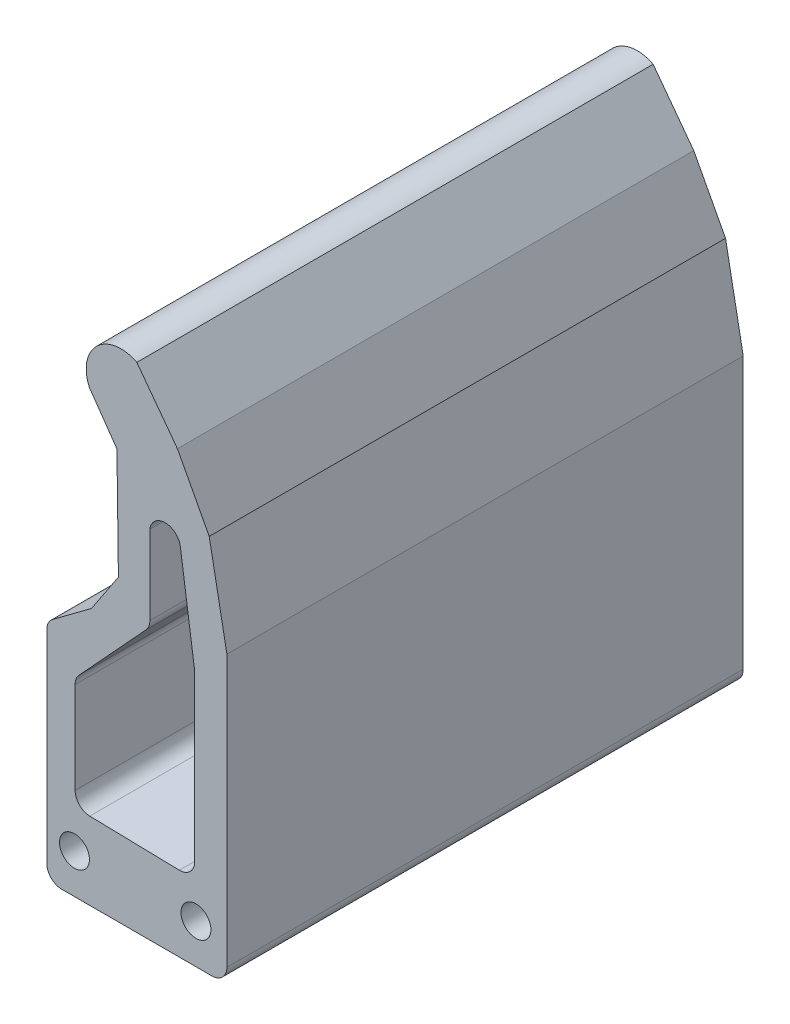
ISO-10303-21;
HEADER;
FILE_DESCRIPTION(('STEP AP214'),'2;1');
FILE_NAME('part.step','',(''),(''),'','','');
FILE_SCHEMA(('AUTOMOTIVE_DESIGN { 1 0 10303 214 1 1 1 1 }'));
ENDSEC;
DATA;
#1=APPLICATION_CONTEXT('core data for automotive mechanical design processes');
#2=APPLICATION_PROTOCOL_DEFINITION('international standard','automotive_design',2000,#1);
#3=PRODUCT_CONTEXT('',#1,'mechanical');
#4=PRODUCT('Part','Part','',(#3));
#5=PRODUCT_RELATED_PRODUCT_CATEGORY('part','',(#4));
#6=PRODUCT_DEFINITION_FORMATION('','',#4);
#7=PRODUCT_DEFINITION_CONTEXT('part definition',#1,'design');
#8=PRODUCT_DEFINITION('design','',#6,#7);
#9=PRODUCT_DEFINITION_SHAPE('','',#8);
#10=(LENGTH_UNIT() NAMED_UNIT(*) SI_UNIT(.MILLI.,.METRE.));
#11=(NAMED_UNIT(*) PLANE_ANGLE_UNIT() SI_UNIT($,.RADIAN.));
#12=(NAMED_UNIT(*) SI_UNIT($,.STERADIAN.) SOLID_ANGLE_UNIT());
#13=UNCERTAINTY_MEASURE_WITH_UNIT(LENGTH_MEASURE(1.E-05),#10,'distance_accuracy_value','');
#14=(GEOMETRIC_REPRESENTATION_CONTEXT(3) GLOBAL_UNCERTAINTY_ASSIGNED_CONTEXT((#13)) GLOBAL_UNIT_ASSIGNED_CONTEXT((#10,
#11,#12)) REPRESENTATION_CONTEXT('',''));
#15=CARTESIAN_POINT('',(0.,0.,0.));
#16=DIRECTION('',(0.,0.,1.));
#17=DIRECTION('',(1.,0.,0.));
#18=AXIS2_PLACEMENT_3D('',#15,#16,#17);
#19=CARTESIAN_POINT('',(-309.924389929028,378.849501293892,74.5));
#20=DIRECTION('',(0.,0.,-1.));
#21=DIRECTION('',(-1.,0.,0.));
#22=AXIS2_PLACEMENT_3D('',#19,#20,#21);
#23=PLANE('',#22);
#24=CARTESIAN_POINT('',(-313.031111026464,350.560286037333,74.5));
#25=DIRECTION('',(0.,0.,1.));
#26=DIRECTION('',(1.,0.,0.));
#27=AXIS2_PLACEMENT_3D('',#24,#25,#26);
#28=CIRCLE('',#27,0.999999999999998);
#29=CARTESIAN_POINT('',(-312.031111026464,350.560286037333,74.5));
#30=VERTEX_POINT('',#29);
#31=EDGE_CURVE('E696',#30,#30,#28,.T.);
#32=ORIENTED_EDGE('',*,*,#31,.F.);
#33=EDGE_LOOP('',(#32));
#34=FACE_BOUND('',#33,.T.);
#35=CARTESIAN_POINT('',(-304.914519909812,350.560286037333,74.5));
#36=DIRECTION('',(0.,0.,1.));
#37=DIRECTION('',(1.,0.,0.));
#38=AXIS2_PLACEMENT_3D('',#35,#36,#37);
#39=CIRCLE('',#38,0.999999999999998);
#40=CARTESIAN_POINT('',(-303.914519909812,350.560286037333,74.5));
#41=VERTEX_POINT('',#40);
#42=EDGE_CURVE('E406',#41,#41,#39,.T.);
#43=ORIENTED_EDGE('',*,*,#42,.F.);
#44=EDGE_LOOP('',(#43));
#45=FACE_BOUND('',#44,.T.);
#46=DIRECTION('',(0.,-1.,0.));
#47=VECTOR('',#46,1.);
#48=CARTESIAN_POINT('',(-314.881683349609,362.936676025391,74.5));
#49=LINE('',#48,#47);
#50=CARTESIAN_POINT('',(-314.881683349609,362.434701670394,74.5));
#51=VERTEX_POINT('',#50);
#52=CARTESIAN_POINT('',(-314.881683349609,348.91843813295,74.5));
#53=VERTEX_POINT('',#52);
#54=EDGE_CURVE('E271',#51,#53,#49,.T.);
#55=ORIENTED_EDGE('',*,*,#54,.T.);
#56=CARTESIAN_POINT('',(-313.881683349609,348.91843813295,74.5));
#57=DIRECTION('',(0.,0.,-1.));
#58=DIRECTION('',(-1.,0.,0.));
#59=AXIS2_PLACEMENT_3D('',#56,#57,#58);
#60=CIRCLE('',#59,1.);
#61=CARTESIAN_POINT('',(-313.881683349609,347.91843813295,74.5));
#62=VERTEX_POINT('',#61);
#63=EDGE_CURVE('E357',#53,#62,#60,.F.);
#64=ORIENTED_EDGE('',*,*,#63,.T.);
#65=DIRECTION('',(1.,0.,0.));
#66=VECTOR('',#65,1.);
#67=CARTESIAN_POINT('',(-314.881683349609,347.91843813295,74.5));
#68=LINE('',#67,#66);
#69=CARTESIAN_POINT('',(-303.847373472753,347.91843813295,74.5));
#70=VERTEX_POINT('',#69);
#71=EDGE_CURVE('E274',#62,#70,#68,.T.);
#72=ORIENTED_EDGE('',*,*,#71,.T.);
#73=CARTESIAN_POINT('',(-303.847373472753,348.91843813295,74.5));
#74=DIRECTION('',(0.,0.,-1.));
#75=DIRECTION('',(-1.,0.,0.));
#76=AXIS2_PLACEMENT_3D('',#73,#74,#75);
#77=CIRCLE('',#76,1.);
#78=CARTESIAN_POINT('',(-302.847373472753,348.918438132951,74.5));
#79=VERTEX_POINT('',#78);
#80=EDGE_CURVE('E355',#70,#79,#77,.F.);
#81=ORIENTED_EDGE('',*,*,#80,.T.);
#82=DIRECTION('',(0.,1.,0.));
#83=VECTOR('',#82,1.);
#84=CARTESIAN_POINT('',(-302.847373472753,347.91843813295,74.5));
#85=LINE('',#84,#83);
#86=CARTESIAN_POINT('',(-302.847373472753,367.045563249939,74.5));
#87=VERTEX_POINT('',#86);
#88=EDGE_CURVE('E277',#79,#87,#85,.T.);
#89=ORIENTED_EDGE('',*,*,#88,.T.);
#90=DIRECTION('',(-0.186540617008645,0.982447249579352,0.));
#91=VECTOR('',#90,1.);
#92=CARTESIAN_POINT('',(-302.847373472753,367.045563249939,74.5));
#93=LINE('',#92,#91);
#94=CARTESIAN_POINT('',(-304.02806020837,373.263846724187,74.5));
#95=VERTEX_POINT('',#94);
#96=EDGE_CURVE('E279',#87,#95,#93,.T.);
#97=ORIENTED_EDGE('',*,*,#96,.T.);
#98=DIRECTION('',(-0.467887720418968,0.883787916347096,0.));
#99=VECTOR('',#98,1.);
#100=CARTESIAN_POINT('',(-304.02806020837,373.263846724187,74.5));
#101=LINE('',#100,#99);
#102=CARTESIAN_POINT('',(-306.153296332479,377.278181625284,74.5));
#103=VERTEX_POINT('',#102);
#104=EDGE_CURVE('E281',#95,#103,#101,.T.);
#105=ORIENTED_EDGE('',*,*,#104,.T.);
#106=DIRECTION('',(-0.597471837141253,0.801889895074789,0.));
#107=VECTOR('',#106,1.);
#108=CARTESIAN_POINT('',(-306.153296332479,377.278181625284,74.5));
#109=LINE('',#108,#107);
#110=CARTESIAN_POINT('',(-308.864528411181,380.917030307284,74.5));
#111=VERTEX_POINT('',#110);
#112=EDGE_CURVE('E283',#103,#111,#109,.T.);
#113=ORIENTED_EDGE('',*,*,#112,.T.);
#114=CARTESIAN_POINT('',(-309.924389929028,378.849501293892,74.5));
#115=DIRECTION('',(0.,0.,1.));
#116=DIRECTION('',(-1.,0.,0.));
#117=AXIS2_PLACEMENT_3D('',#114,#115,#116);
#118=CIRCLE('',#117,2.32335590433929);
#119=CARTESIAN_POINT('',(-312.030492527549,377.868524993092,74.5));
#120=VERTEX_POINT('',#119);
#121=EDGE_CURVE('E258',#111,#120,#118,.T.);
#122=ORIENTED_EDGE('',*,*,#121,.T.);
#123=DIRECTION('',(0.57346234436332,-0.819231920519046,0.));
#124=VECTOR('',#123,1.);
#125=CARTESIAN_POINT('',(-312.030492527549,377.868524993092,74.5));
#126=LINE('',#125,#124);
#127=CARTESIAN_POINT('',(-310.193868716589,375.244776691722,74.5));
#128=VERTEX_POINT('',#127);
#129=EDGE_CURVE('E261',#120,#128,#126,.T.);
#130=ORIENTED_EDGE('',*,*,#129,.T.);
#131=DIRECTION('',(0.0132778277471396,-0.999911845759574,0.));
#132=VECTOR('',#131,1.);
#133=CARTESIAN_POINT('',(-310.193868716589,375.244776691722,74.5));
#134=LINE('',#133,#132);
#135=CARTESIAN_POINT('',(-310.096008300781,367.875213623047,74.5));
#136=VERTEX_POINT('',#135);
#137=EDGE_CURVE('E264',#128,#136,#134,.T.);
#138=ORIENTED_EDGE('',*,*,#137,.T.);
#139=DIRECTION('',(-0.551967778134634,-0.833865439924881,0.));
#140=VECTOR('',#139,1.);
#141=CARTESIAN_POINT('',(-310.096008300781,367.875213623047,74.5));
#142=LINE('',#141,#140);
#143=CARTESIAN_POINT('',(-311.889068603516,365.166412353516,74.5));
#144=VERTEX_POINT('',#143);
#145=EDGE_CURVE('E266',#136,#144,#142,.T.);
#146=ORIENTED_EDGE('',*,*,#145,.T.);
#147=DIRECTION('',(-0.801889895074793,-0.597471837141247,0.));
#148=VECTOR('',#147,1.);
#149=CARTESIAN_POINT('',(-311.889068603516,365.166412353516,74.5));
#150=LINE('',#149,#148);
#151=CARTESIAN_POINT('',(-314.479155186751,363.236591565468,74.5));
#152=VERTEX_POINT('',#151);
#153=EDGE_CURVE('E268',#144,#152,#150,.T.);
#154=ORIENTED_EDGE('',*,*,#153,.T.);
#155=CARTESIAN_POINT('',(-313.881683349609,362.434701670394,74.5));
#156=DIRECTION('',(0.,0.,-1.));
#157=DIRECTION('',(-1.,0.,0.));
#158=AXIS2_PLACEMENT_3D('',#155,#156,#157);
#159=CIRCLE('',#158,1.);
#160=EDGE_CURVE('E353',#152,#51,#159,.F.);
#161=ORIENTED_EDGE('',*,*,#160,.T.);
#162=EDGE_LOOP('',(#55,#64,#72,#81,#89,#97,#105,#113,#122,#130,#138,#146,#154,#161));
#163=FACE_BOUND('',#162,.T.);
#164=DIRECTION('',(-0.677265288833009,-0.735738899706914,0.));
#165=VECTOR('',#164,1.);
#166=CARTESIAN_POINT('',(-312.988408733801,360.598376943002,74.5));
#167=LINE('',#166,#165);
#168=CARTESIAN_POINT('',(-308.25886216006,365.736262273391,74.5));
#169=VERTEX_POINT('',#168);
#170=CARTESIAN_POINT('',(-312.724147633508,360.885453771492,74.5));
#171=VERTEX_POINT('',#170);
#172=EDGE_CURVE('E255',#169,#171,#167,.T.);
#173=ORIENTED_EDGE('',*,*,#172,.F.);
#174=CARTESIAN_POINT('',(-308.994601059767,366.413527562224,74.5));
#175=DIRECTION('',(0.,0.,-1.));
#176=DIRECTION('',(-1.,0.,0.));
#177=AXIS2_PLACEMENT_3D('',#174,#175,#176);
#178=CIRCLE('',#177,1.);
#179=CARTESIAN_POINT('',(-307.994601059767,366.413527562224,74.5));
#180=VERTEX_POINT('',#179);
#181=EDGE_CURVE('E351',#169,#180,#178,.F.);
#182=ORIENTED_EDGE('',*,*,#181,.T.);
#183=DIRECTION('',(0.,-1.,0.));
#184=VECTOR('',#183,1.);
#185=CARTESIAN_POINT('',(-307.994601059767,366.023339101882,74.5));
#186=LINE('',#185,#184);
#187=CARTESIAN_POINT('',(-307.994601059767,371.702683918454,74.5));
#188=VERTEX_POINT('',#187);
#189=EDGE_CURVE('E229',#188,#180,#186,.T.);
#190=ORIENTED_EDGE('',*,*,#189,.F.);
#191=CARTESIAN_POINT('',(-306.975817077351,371.555647556688,74.5));
#192=DIRECTION('',(0.,0.,1.));
#193=DIRECTION('',(-1.,0.,0.));
#194=AXIS2_PLACEMENT_3D('',#191,#192,#193);
#195=CIRCLE('',#194,1.02933983431598);
#196=CARTESIAN_POINT('',(-305.952850341797,371.670013427734,74.5));
#197=VERTEX_POINT('',#196);
#198=EDGE_CURVE('E227',#197,#188,#195,.T.);
#199=ORIENTED_EDGE('',*,*,#198,.F.);
#200=DIRECTION('',(-0.141420088017463,0.989949674834601,0.));
#201=VECTOR('',#200,1.);
#202=CARTESIAN_POINT('',(-305.,365.,74.5));
#203=LINE('',#202,#201);
#204=CARTESIAN_POINT('',(-305.,365.,74.5));
#205=VERTEX_POINT('',#204);
#206=EDGE_CURVE('E212',#205,#197,#203,.T.);
#207=ORIENTED_EDGE('',*,*,#206,.F.);
#208=DIRECTION('',(0.,1.,0.));
#209=VECTOR('',#208,1.);
#210=CARTESIAN_POINT('',(-305.,352.927314192685,74.5));
#211=LINE('',#210,#209);
#212=CARTESIAN_POINT('',(-305.,353.950441861552,74.5));
#213=VERTEX_POINT('',#212);
#214=EDGE_CURVE('E202',#213,#205,#211,.T.);
#215=ORIENTED_EDGE('',*,*,#214,.F.);
#216=CARTESIAN_POINT('',(-306.,353.950441861552,74.5));
#217=DIRECTION('',(0.,0.,-1.));
#218=DIRECTION('',(-1.,0.,0.));
#219=AXIS2_PLACEMENT_3D('',#216,#217,#218);
#220=CIRCLE('',#219,1.);
#221=CARTESIAN_POINT('',(-306.022860294224,352.950703192225,74.5));
#222=VERTEX_POINT('',#221);
#223=EDGE_CURVE('E384',#213,#222,#220,.T.);
#224=ORIENTED_EDGE('',*,*,#223,.T.);
#225=DIRECTION('',(0.999738669327124,-0.0228602942245161,0.));
#226=VECTOR('',#225,1.);
#227=CARTESIAN_POINT('',(-312.988408733801,353.109979302722,74.5));
#228=LINE('',#227,#226);
#229=CARTESIAN_POINT('',(-312.011269028026,353.087635762497,74.5));
#230=VERTEX_POINT('',#229);
#231=EDGE_CURVE('E213',#230,#222,#228,.T.);
#232=ORIENTED_EDGE('',*,*,#231,.F.);
#233=CARTESIAN_POINT('',(-311.988408733801,354.087374431824,74.5));
#234=DIRECTION('',(0.,0.,-1.));
#235=DIRECTION('',(-1.,0.,0.));
#236=AXIS2_PLACEMENT_3D('',#233,#234,#235);
#237=CIRCLE('',#236,1.);
#238=CARTESIAN_POINT('',(-312.988408733801,354.087374431824,74.5));
#239=VERTEX_POINT('',#238);
#240=EDGE_CURVE('E49',#230,#239,#237,.T.);
#241=ORIENTED_EDGE('',*,*,#240,.T.);
#242=DIRECTION('',(0.,-1.,0.));
#243=VECTOR('',#242,1.);
#244=CARTESIAN_POINT('',(-312.988408733801,360.598376943002,74.5));
#245=LINE('',#244,#243);
#246=CARTESIAN_POINT('',(-312.988408733801,360.208188482659,74.5));
#247=VERTEX_POINT('',#246);
#248=EDGE_CURVE('E399',#247,#239,#245,.T.);
#249=ORIENTED_EDGE('',*,*,#248,.F.);
#250=CARTESIAN_POINT('',(-311.988408733801,360.208188482659,74.5));
#251=DIRECTION('',(0.,0.,-1.));
#252=DIRECTION('',(-1.,0.,0.));
#253=AXIS2_PLACEMENT_3D('',#250,#251,#252);
#254=CIRCLE('',#253,1.);
#255=EDGE_CURVE('E11',#247,#171,#254,.T.);
#256=ORIENTED_EDGE('',*,*,#255,.T.);
#257=EDGE_LOOP('',(#173,#182,#190,#199,#207,#215,#224,#232,#241,#249,#256));
#258=FACE_BOUND('',#257,.T.);
#259=ADVANCED_FACE('F34',(#34,#45,#163,#258),#23,.F.);
#260=CARTESIAN_POINT('',(-309.924389929028,378.849501293892,40.));
#261=DIRECTION('',(0.,0.,-1.));
#262=DIRECTION('',(-1.,0.,0.));
#263=AXIS2_PLACEMENT_3D('',#260,#261,#262);
#264=PLANE('',#263);
#265=CARTESIAN_POINT('',(-313.031111026464,350.560286037333,40.));
#266=DIRECTION('',(0.,0.,1.));
#267=DIRECTION('',(1.,0.,0.));
#268=AXIS2_PLACEMENT_3D('',#265,#266,#267);
#269=CIRCLE('',#268,0.999999999999998);
#270=CARTESIAN_POINT('',(-312.031111026464,350.560286037333,40.));
#271=VERTEX_POINT('',#270);
#272=EDGE_CURVE('E240',#271,#271,#269,.T.);
#273=ORIENTED_EDGE('',*,*,#272,.T.);
#274=EDGE_LOOP('',(#273));
#275=FACE_BOUND('',#274,.T.);
#276=CARTESIAN_POINT('',(-304.914519909812,350.560286037333,40.));
#277=DIRECTION('',(0.,0.,1.));
#278=DIRECTION('',(1.,0.,0.));
#279=AXIS2_PLACEMENT_3D('',#276,#277,#278);
#280=CIRCLE('',#279,0.999999999999998);
#281=CARTESIAN_POINT('',(-303.914519909812,350.560286037333,40.));
#282=VERTEX_POINT('',#281);
#283=EDGE_CURVE('E697',#282,#282,#280,.T.);
#284=ORIENTED_EDGE('',*,*,#283,.T.);
#285=EDGE_LOOP('',(#284));
#286=FACE_BOUND('',#285,.T.);
#287=DIRECTION('',(1.,0.,0.));
#288=VECTOR('',#287,1.);
#289=CARTESIAN_POINT('',(-314.881683349609,347.91843813295,40.));
#290=LINE('',#289,#288);
#291=CARTESIAN_POINT('',(-313.881683349609,347.91843813295,40.));
#292=VERTEX_POINT('',#291);
#293=CARTESIAN_POINT('',(-303.847373472753,347.91843813295,40.));
#294=VERTEX_POINT('',#293);
#295=EDGE_CURVE('E300',#292,#294,#290,.T.);
#296=ORIENTED_EDGE('',*,*,#295,.F.);
#297=CARTESIAN_POINT('',(-313.881683349609,348.91843813295,40.));
#298=DIRECTION('',(0.,0.,-1.));
#299=DIRECTION('',(-1.,0.,0.));
#300=AXIS2_PLACEMENT_3D('',#297,#298,#299);
#301=CIRCLE('',#300,1.);
#302=CARTESIAN_POINT('',(-314.881683349609,348.91843813295,40.));
#303=VERTEX_POINT('',#302);
#304=EDGE_CURVE('E344',#292,#303,#301,.T.);
#305=ORIENTED_EDGE('',*,*,#304,.T.);
#306=DIRECTION('',(0.,-1.,0.));
#307=VECTOR('',#306,1.);
#308=CARTESIAN_POINT('',(-314.881683349609,362.936676025391,40.));
#309=LINE('',#308,#307);
#310=CARTESIAN_POINT('',(-314.881683349609,362.434701670394,40.));
#311=VERTEX_POINT('',#310);
#312=EDGE_CURVE('E297',#311,#303,#309,.T.);
#313=ORIENTED_EDGE('',*,*,#312,.F.);
#314=CARTESIAN_POINT('',(-313.881683349609,362.434701670394,40.));
#315=DIRECTION('',(0.,0.,-1.));
#316=DIRECTION('',(-1.,0.,0.));
#317=AXIS2_PLACEMENT_3D('',#314,#315,#316);
#318=CIRCLE('',#317,1.);
#319=CARTESIAN_POINT('',(-314.479155186751,363.236591565468,40.));
#320=VERTEX_POINT('',#319);
#321=EDGE_CURVE('E340',#311,#320,#318,.T.);
#322=ORIENTED_EDGE('',*,*,#321,.T.);
#323=DIRECTION('',(-0.801889895074793,-0.597471837141247,0.));
#324=VECTOR('',#323,1.);
#325=CARTESIAN_POINT('',(-311.889068603516,365.166412353516,40.));
#326=LINE('',#325,#324);
#327=CARTESIAN_POINT('',(-311.889068603516,365.166412353516,40.));
#328=VERTEX_POINT('',#327);
#329=EDGE_CURVE('E294',#328,#320,#326,.T.);
#330=ORIENTED_EDGE('',*,*,#329,.F.);
#331=DIRECTION('',(-0.551967778134634,-0.833865439924881,0.));
#332=VECTOR('',#331,1.);
#333=CARTESIAN_POINT('',(-310.096008300781,367.875213623047,40.));
#334=LINE('',#333,#332);
#335=CARTESIAN_POINT('',(-310.096008300781,367.875213623047,40.));
#336=VERTEX_POINT('',#335);
#337=EDGE_CURVE('E292',#336,#328,#334,.T.);
#338=ORIENTED_EDGE('',*,*,#337,.F.);
#339=DIRECTION('',(0.0132778277471396,-0.999911845759574,0.));
#340=VECTOR('',#339,1.);
#341=CARTESIAN_POINT('',(-310.193868716589,375.244776691722,40.));
#342=LINE('',#341,#340);
#343=CARTESIAN_POINT('',(-310.193868716589,375.244776691722,40.));
#344=VERTEX_POINT('',#343);
#345=EDGE_CURVE('E290',#344,#336,#342,.T.);
#346=ORIENTED_EDGE('',*,*,#345,.F.);
#347=DIRECTION('',(0.57346234436332,-0.819231920519046,0.));
#348=VECTOR('',#347,1.);
#349=CARTESIAN_POINT('',(-312.030492527549,377.868524993092,40.));
#350=LINE('',#349,#348);
#351=CARTESIAN_POINT('',(-312.030492527549,377.868524993092,40.));
#352=VERTEX_POINT('',#351);
#353=EDGE_CURVE('E288',#352,#344,#350,.T.);
#354=ORIENTED_EDGE('',*,*,#353,.F.);
#355=CARTESIAN_POINT('',(-309.924389929028,378.849501293892,40.));
#356=DIRECTION('',(0.,0.,1.));
#357=DIRECTION('',(-1.,0.,0.));
#358=AXIS2_PLACEMENT_3D('',#355,#356,#357);
#359=CIRCLE('',#358,2.32335590433929);
#360=CARTESIAN_POINT('',(-308.864528411181,380.917030307284,40.));
#361=VERTEX_POINT('',#360);
#362=EDGE_CURVE('E220',#361,#352,#359,.T.);
#363=ORIENTED_EDGE('',*,*,#362,.F.);
#364=DIRECTION('',(-0.597471837141253,0.801889895074789,0.));
#365=VECTOR('',#364,1.);
#366=CARTESIAN_POINT('',(-306.153296332479,377.278181625284,40.));
#367=LINE('',#366,#365);
#368=CARTESIAN_POINT('',(-306.153296332479,377.278181625284,40.));
#369=VERTEX_POINT('',#368);
#370=EDGE_CURVE('E262',#369,#361,#367,.T.);
#371=ORIENTED_EDGE('',*,*,#370,.F.);
#372=DIRECTION('',(-0.467887720418968,0.883787916347096,0.));
#373=VECTOR('',#372,1.);
#374=CARTESIAN_POINT('',(-304.02806020837,373.263846724187,40.));
#375=LINE('',#374,#373);
#376=CARTESIAN_POINT('',(-304.02806020837,373.263846724187,40.));
#377=VERTEX_POINT('',#376);
#378=EDGE_CURVE('E307',#377,#369,#375,.T.);
#379=ORIENTED_EDGE('',*,*,#378,.F.);
#380=DIRECTION('',(-0.186540617008645,0.982447249579352,0.));
#381=VECTOR('',#380,1.);
#382=CARTESIAN_POINT('',(-302.847373472753,367.045563249939,40.));
#383=LINE('',#382,#381);
#384=CARTESIAN_POINT('',(-302.847373472753,367.045563249939,40.));
#385=VERTEX_POINT('',#384);
#386=EDGE_CURVE('E305',#385,#377,#383,.T.);
#387=ORIENTED_EDGE('',*,*,#386,.F.);
#388=DIRECTION('',(0.,1.,0.));
#389=VECTOR('',#388,1.);
#390=CARTESIAN_POINT('',(-302.847373472753,347.91843813295,40.));
#391=LINE('',#390,#389);
#392=CARTESIAN_POINT('',(-302.847373472753,348.918438132951,40.));
#393=VERTEX_POINT('',#392);
#394=EDGE_CURVE('E303',#393,#385,#391,.T.);
#395=ORIENTED_EDGE('',*,*,#394,.F.);
#396=CARTESIAN_POINT('',(-303.847373472753,348.91843813295,40.));
#397=DIRECTION('',(0.,0.,-1.));
#398=DIRECTION('',(-1.,0.,0.));
#399=AXIS2_PLACEMENT_3D('',#396,#397,#398);
#400=CIRCLE('',#399,1.);
#401=EDGE_CURVE('E342',#393,#294,#400,.T.);
#402=ORIENTED_EDGE('',*,*,#401,.T.);
#403=EDGE_LOOP('',(#296,#305,#313,#322,#330,#338,#346,#354,#363,#371,#379,#387,#395,#402));
#404=FACE_BOUND('',#403,.T.);
#405=DIRECTION('',(0.,-1.,0.));
#406=VECTOR('',#405,1.);
#407=CARTESIAN_POINT('',(-307.994601059767,366.023339101882,40.));
#408=LINE('',#407,#406);
#409=CARTESIAN_POINT('',(-307.994601059767,371.702683918454,40.));
#410=VERTEX_POINT('',#409);
#411=CARTESIAN_POINT('',(-307.994601059767,366.413527562224,40.));
#412=VERTEX_POINT('',#411);
#413=EDGE_CURVE('E252',#410,#412,#408,.T.);
#414=ORIENTED_EDGE('',*,*,#413,.T.);
#415=CARTESIAN_POINT('',(-308.994601059767,366.413527562224,40.));
#416=DIRECTION('',(0.,0.,-1.));
#417=DIRECTION('',(-1.,0.,0.));
#418=AXIS2_PLACEMENT_3D('',#415,#416,#417);
#419=CIRCLE('',#418,1.);
#420=CARTESIAN_POINT('',(-308.25886216006,365.736262273391,40.));
#421=VERTEX_POINT('',#420);
#422=EDGE_CURVE('E338',#412,#421,#419,.T.);
#423=ORIENTED_EDGE('',*,*,#422,.T.);
#424=DIRECTION('',(-0.677265288833009,-0.735738899706914,0.));
#425=VECTOR('',#424,1.);
#426=CARTESIAN_POINT('',(-312.988408733801,360.598376943002,40.));
#427=LINE('',#426,#425);
#428=CARTESIAN_POINT('',(-312.724147633508,360.885453771492,40.));
#429=VERTEX_POINT('',#428);
#430=EDGE_CURVE('E236',#421,#429,#427,.T.);
#431=ORIENTED_EDGE('',*,*,#430,.T.);
#432=CARTESIAN_POINT('',(-311.988408733801,360.208188482659,40.));
#433=DIRECTION('',(0.,0.,-1.));
#434=DIRECTION('',(-1.,0.,0.));
#435=AXIS2_PLACEMENT_3D('',#432,#433,#434);
#436=CIRCLE('',#435,1.);
#437=CARTESIAN_POINT('',(-312.988408733801,360.208188482659,40.));
#438=VERTEX_POINT('',#437);
#439=EDGE_CURVE('E42',#429,#438,#436,.F.);
#440=ORIENTED_EDGE('',*,*,#439,.T.);
#441=DIRECTION('',(0.,-1.,0.));
#442=VECTOR('',#441,1.);
#443=CARTESIAN_POINT('',(-312.988408733801,360.598376943002,40.));
#444=LINE('',#443,#442);
#445=CARTESIAN_POINT('',(-312.988408733801,354.087374431824,40.));
#446=VERTEX_POINT('',#445);
#447=EDGE_CURVE('E239',#438,#446,#444,.T.);
#448=ORIENTED_EDGE('',*,*,#447,.T.);
#449=CARTESIAN_POINT('',(-311.988408733801,354.087374431824,40.));
#450=DIRECTION('',(0.,0.,-1.));
#451=DIRECTION('',(-1.,0.,0.));
#452=AXIS2_PLACEMENT_3D('',#449,#450,#451);
#453=CIRCLE('',#452,1.);
#454=CARTESIAN_POINT('',(-312.011269028026,353.087635762497,40.));
#455=VERTEX_POINT('',#454);
#456=EDGE_CURVE('E386',#446,#455,#453,.F.);
#457=ORIENTED_EDGE('',*,*,#456,.T.);
#458=DIRECTION('',(0.999738669327124,-0.0228602942245161,0.));
#459=VECTOR('',#458,1.);
#460=CARTESIAN_POINT('',(-312.988408733801,353.109979302722,40.));
#461=LINE('',#460,#459);
#462=CARTESIAN_POINT('',(-306.022860294224,352.950703192225,40.));
#463=VERTEX_POINT('',#462);
#464=EDGE_CURVE('E243',#455,#463,#461,.T.);
#465=ORIENTED_EDGE('',*,*,#464,.T.);
#466=CARTESIAN_POINT('',(-306.,353.950441861552,40.));
#467=DIRECTION('',(0.,0.,-1.));
#468=DIRECTION('',(-1.,0.,0.));
#469=AXIS2_PLACEMENT_3D('',#466,#467,#468);
#470=CIRCLE('',#469,1.);
#471=CARTESIAN_POINT('',(-305.,353.950441861552,40.));
#472=VERTEX_POINT('',#471);
#473=EDGE_CURVE('E382',#463,#472,#470,.F.);
#474=ORIENTED_EDGE('',*,*,#473,.T.);
#475=DIRECTION('',(0.,1.,0.));
#476=VECTOR('',#475,1.);
#477=CARTESIAN_POINT('',(-305.,352.927314192685,40.));
#478=LINE('',#477,#476);
#479=CARTESIAN_POINT('',(-305.,365.,40.));
#480=VERTEX_POINT('',#479);
#481=EDGE_CURVE('E246',#472,#480,#478,.T.);
#482=ORIENTED_EDGE('',*,*,#481,.T.);
#483=DIRECTION('',(-0.141420088017463,0.989949674834601,0.));
#484=VECTOR('',#483,1.);
#485=CARTESIAN_POINT('',(-305.,365.,40.));
#486=LINE('',#485,#484);
#487=CARTESIAN_POINT('',(-305.952850341797,371.670013427734,40.));
#488=VERTEX_POINT('',#487);
#489=EDGE_CURVE('E219',#480,#488,#486,.T.);
#490=ORIENTED_EDGE('',*,*,#489,.T.);
#491=CARTESIAN_POINT('',(-306.975817077351,371.555647556688,40.));
#492=DIRECTION('',(0.,0.,1.));
#493=DIRECTION('',(-1.,0.,0.));
#494=AXIS2_PLACEMENT_3D('',#491,#492,#493);
#495=CIRCLE('',#494,1.02933983431598);
#496=EDGE_CURVE('E249',#488,#410,#495,.T.);
#497=ORIENTED_EDGE('',*,*,#496,.T.);
#498=EDGE_LOOP('',(#414,#423,#431,#440,#448,#457,#465,#474,#482,#490,#497));
#499=FACE_BOUND('',#498,.T.);
#500=ADVANCED_FACE('F389',(#275,#286,#404,#499),#264,.T.);
#501=CARTESIAN_POINT('',(-309.924389929028,378.849501293892,74.5));
#502=DIRECTION('',(0.,0.,-1.));
#503=DIRECTION('',(-1.,0.,0.));
#504=AXIS2_PLACEMENT_3D('',#501,#502,#503);
#505=CYLINDRICAL_SURFACE('',#504,2.32335590433929);
#506=ORIENTED_EDGE('',*,*,#362,.T.);
#507=DIRECTION('',(0.,0.,-1.));
#508=VECTOR('',#507,1.);
#509=CARTESIAN_POINT('',(-312.030492527549,377.868524993092,74.5));
#510=LINE('',#509,#508);
#511=EDGE_CURVE('E330',#120,#352,#510,.T.);
#512=ORIENTED_EDGE('',*,*,#511,.F.);
#513=ORIENTED_EDGE('',*,*,#121,.F.);
#514=DIRECTION('',(0.,0.,-1.));
#515=VECTOR('',#514,1.);
#516=CARTESIAN_POINT('',(-308.864528411181,380.917030307284,74.5));
#517=LINE('',#516,#515);
#518=EDGE_CURVE('E285',#111,#361,#517,.T.);
#519=ORIENTED_EDGE('',*,*,#518,.T.);
#520=EDGE_LOOP('',(#506,#512,#513,#519));
#521=FACE_BOUND('',#520,.T.);
#522=ADVANCED_FACE('F436',(#521),#505,.T.);
#523=CARTESIAN_POINT('',(-312.030492527549,377.868524993092,74.5));
#524=DIRECTION('',(0.819231920519046,0.57346234436332,0.));
#525=DIRECTION('',(-0.57346234436332,0.819231920519046,0.));
#526=AXIS2_PLACEMENT_3D('',#523,#524,#525);
#527=PLANE('',#526);
#528=ORIENTED_EDGE('',*,*,#353,.T.);
#529=DIRECTION('',(0.,0.,-1.));
#530=VECTOR('',#529,1.);
#531=CARTESIAN_POINT('',(-310.193868716589,375.244776691722,74.5));
#532=LINE('',#531,#530);
#533=EDGE_CURVE('E327',#128,#344,#532,.T.);
#534=ORIENTED_EDGE('',*,*,#533,.F.);
#535=ORIENTED_EDGE('',*,*,#129,.F.);
#536=ORIENTED_EDGE('',*,*,#511,.T.);
#537=EDGE_LOOP('',(#528,#534,#535,#536));
#538=FACE_BOUND('',#537,.T.);
#539=ADVANCED_FACE('F479',(#538),#527,.F.);
#540=CARTESIAN_POINT('',(-310.193868716589,375.244776691722,74.5));
#541=DIRECTION('',(0.999911845759574,0.0132778277471396,0.));
#542=DIRECTION('',(-0.0132778277471396,0.999911845759574,0.));
#543=AXIS2_PLACEMENT_3D('',#540,#541,#542);
#544=PLANE('',#543);
#545=ORIENTED_EDGE('',*,*,#345,.T.);
#546=DIRECTION('',(0.,0.,-1.));
#547=VECTOR('',#546,1.);
#548=CARTESIAN_POINT('',(-310.096008300781,367.875213623047,74.5));
#549=LINE('',#548,#547);
#550=EDGE_CURVE('E324',#136,#336,#549,.T.);
#551=ORIENTED_EDGE('',*,*,#550,.F.);
#552=ORIENTED_EDGE('',*,*,#137,.F.);
#553=ORIENTED_EDGE('',*,*,#533,.T.);
#554=EDGE_LOOP('',(#545,#551,#552,#553));
#555=FACE_BOUND('',#554,.T.);
#556=ADVANCED_FACE('F475',(#555),#544,.F.);
#557=CARTESIAN_POINT('',(-310.096008300781,367.875213623047,74.5));
#558=DIRECTION('',(0.833865439924881,-0.551967778134634,0.));
#559=DIRECTION('',(0.551967778134634,0.833865439924881,0.));
#560=AXIS2_PLACEMENT_3D('',#557,#558,#559);
#561=PLANE('',#560);
#562=ORIENTED_EDGE('',*,*,#337,.T.);
#563=DIRECTION('',(0.,0.,-1.));
#564=VECTOR('',#563,1.);
#565=CARTESIAN_POINT('',(-311.889068603516,365.166412353516,74.5));
#566=LINE('',#565,#564);
#567=EDGE_CURVE('E321',#144,#328,#566,.T.);
#568=ORIENTED_EDGE('',*,*,#567,.F.);
#569=ORIENTED_EDGE('',*,*,#145,.F.);
#570=ORIENTED_EDGE('',*,*,#550,.T.);
#571=EDGE_LOOP('',(#562,#568,#569,#570));
#572=FACE_BOUND('',#571,.T.);
#573=ADVANCED_FACE('F471',(#572),#561,.F.);
#574=CARTESIAN_POINT('',(-311.889068603516,365.166412353516,74.5));
#575=DIRECTION('',(0.597471837141247,-0.801889895074793,0.));
#576=DIRECTION('',(0.801889895074793,0.597471837141247,0.));
#577=AXIS2_PLACEMENT_3D('',#574,#575,#576);
#578=PLANE('',#577);
#579=ORIENTED_EDGE('',*,*,#329,.T.);
#580=DIRECTION('',(0.,0.,-1.));
#581=VECTOR('',#580,1.);
#582=CARTESIAN_POINT('',(-314.479155186751,363.236591565468,74.5));
#583=LINE('',#582,#581);
#584=EDGE_CURVE('E372',#320,#152,#583,.F.);
#585=ORIENTED_EDGE('',*,*,#584,.T.);
#586=ORIENTED_EDGE('',*,*,#153,.F.);
#587=ORIENTED_EDGE('',*,*,#567,.T.);
#588=EDGE_LOOP('',(#579,#585,#586,#587));
#589=FACE_BOUND('',#588,.T.);
#590=ADVANCED_FACE('F467',(#589),#578,.F.);
#591=CARTESIAN_POINT('',(-314.881683349609,362.936676025391,74.5));
#592=DIRECTION('',(1.,0.,0.));
#593=DIRECTION('',(0.,0.,-1.));
#594=AXIS2_PLACEMENT_3D('',#591,#592,#593);
#595=PLANE('',#594);
#596=ORIENTED_EDGE('',*,*,#312,.T.);
#597=DIRECTION('',(0.,0.,-1.));
#598=VECTOR('',#597,1.);
#599=CARTESIAN_POINT('',(-314.881683349609,348.91843813295,74.5));
#600=LINE('',#599,#598);
#601=EDGE_CURVE('E349',#303,#53,#600,.F.);
#602=ORIENTED_EDGE('',*,*,#601,.T.);
#603=ORIENTED_EDGE('',*,*,#54,.F.);
#604=DIRECTION('',(0.,0.,-1.));
#605=VECTOR('',#604,1.);
#606=CARTESIAN_POINT('',(-314.881683349609,362.434701670394,74.5));
#607=LINE('',#606,#605);
#608=EDGE_CURVE('E346',#51,#311,#607,.T.);
#609=ORIENTED_EDGE('',*,*,#608,.T.);
#610=EDGE_LOOP('',(#596,#602,#603,#609));
#611=FACE_BOUND('',#610,.T.);
#612=ADVANCED_FACE('F463',(#611),#595,.F.);
#613=CARTESIAN_POINT('',(-314.881683349609,347.91843813295,74.5));
#614=DIRECTION('',(0.,1.,0.));
#615=DIRECTION('',(0.,0.,1.));
#616=AXIS2_PLACEMENT_3D('',#613,#614,#615);
#617=PLANE('',#616);
#618=ORIENTED_EDGE('',*,*,#71,.F.);
#619=DIRECTION('',(0.,0.,-1.));
#620=VECTOR('',#619,1.);
#621=CARTESIAN_POINT('',(-313.881683349609,347.91843813295,74.5));
#622=LINE('',#621,#620);
#623=EDGE_CURVE('E335',#62,#292,#622,.T.);
#624=ORIENTED_EDGE('',*,*,#623,.T.);
#625=ORIENTED_EDGE('',*,*,#295,.T.);
#626=DIRECTION('',(0.,0.,-1.));
#627=VECTOR('',#626,1.);
#628=CARTESIAN_POINT('',(-303.847373472753,347.91843813295,74.5));
#629=LINE('',#628,#627);
#630=EDGE_CURVE('E333',#294,#70,#629,.F.);
#631=ORIENTED_EDGE('',*,*,#630,.T.);
#632=EDGE_LOOP('',(#618,#624,#625,#631));
#633=FACE_BOUND('',#632,.T.);
#634=ADVANCED_FACE('F459',(#633),#617,.F.);
#635=CARTESIAN_POINT('',(-302.847373472753,347.91843813295,74.5));
#636=DIRECTION('',(-1.,0.,0.));
#637=DIRECTION('',(0.,-1.,0.));
#638=AXIS2_PLACEMENT_3D('',#635,#636,#637);
#639=PLANE('',#638);
#640=ORIENTED_EDGE('',*,*,#88,.F.);
#641=DIRECTION('',(0.,0.,-1.));
#642=VECTOR('',#641,1.);
#643=CARTESIAN_POINT('',(-302.847373472753,348.918438132951,74.5));
#644=LINE('',#643,#642);
#645=EDGE_CURVE('E365',#79,#393,#644,.T.);
#646=ORIENTED_EDGE('',*,*,#645,.T.);
#647=ORIENTED_EDGE('',*,*,#394,.T.);
#648=DIRECTION('',(0.,0.,-1.));
#649=VECTOR('',#648,1.);
#650=CARTESIAN_POINT('',(-302.847373472753,367.045563249939,74.5));
#651=LINE('',#650,#649);
#652=EDGE_CURVE('E318',#87,#385,#651,.T.);
#653=ORIENTED_EDGE('',*,*,#652,.F.);
#654=EDGE_LOOP('',(#640,#646,#647,#653));
#655=FACE_BOUND('',#654,.T.);
#656=ADVANCED_FACE('F455',(#655),#639,.F.);
#657=CARTESIAN_POINT('',(-302.847373472753,367.045563249939,74.5));
#658=DIRECTION('',(-0.982447249579352,-0.186540617008645,0.));
#659=DIRECTION('',(0.186540617008645,-0.982447249579352,0.));
#660=AXIS2_PLACEMENT_3D('',#657,#658,#659);
#661=PLANE('',#660);
#662=ORIENTED_EDGE('',*,*,#386,.T.);
#663=DIRECTION('',(0.,0.,-1.));
#664=VECTOR('',#663,1.);
#665=CARTESIAN_POINT('',(-304.02806020837,373.263846724187,74.5));
#666=LINE('',#665,#664);
#667=EDGE_CURVE('E315',#95,#377,#666,.T.);
#668=ORIENTED_EDGE('',*,*,#667,.F.);
#669=ORIENTED_EDGE('',*,*,#96,.F.);
#670=ORIENTED_EDGE('',*,*,#652,.T.);
#671=EDGE_LOOP('',(#662,#668,#669,#670));
#672=FACE_BOUND('',#671,.T.);
#673=ADVANCED_FACE('F451',(#672),#661,.F.);
#674=CARTESIAN_POINT('',(-304.02806020837,373.263846724187,74.5));
#675=DIRECTION('',(-0.883787916347096,-0.467887720418968,0.));
#676=DIRECTION('',(0.467887720418968,-0.883787916347096,0.));
#677=AXIS2_PLACEMENT_3D('',#674,#675,#676);
#678=PLANE('',#677);
#679=ORIENTED_EDGE('',*,*,#378,.T.);
#680=DIRECTION('',(0.,0.,-1.));
#681=VECTOR('',#680,1.);
#682=CARTESIAN_POINT('',(-306.153296332479,377.278181625284,74.5));
#683=LINE('',#682,#681);
#684=EDGE_CURVE('E312',#103,#369,#683,.T.);
#685=ORIENTED_EDGE('',*,*,#684,.F.);
#686=ORIENTED_EDGE('',*,*,#104,.F.);
#687=ORIENTED_EDGE('',*,*,#667,.T.);
#688=EDGE_LOOP('',(#679,#685,#686,#687));
#689=FACE_BOUND('',#688,.T.);
#690=ADVANCED_FACE('F447',(#689),#678,.F.);
#691=CARTESIAN_POINT('',(-306.153296332479,377.278181625284,74.5));
#692=DIRECTION('',(-0.801889895074789,-0.597471837141253,0.));
#693=DIRECTION('',(0.597471837141253,-0.801889895074789,0.));
#694=AXIS2_PLACEMENT_3D('',#691,#692,#693);
#695=PLANE('',#694);
#696=ORIENTED_EDGE('',*,*,#370,.T.);
#697=ORIENTED_EDGE('',*,*,#518,.F.);
#698=ORIENTED_EDGE('',*,*,#112,.F.);
#699=ORIENTED_EDGE('',*,*,#684,.T.);
#700=EDGE_LOOP('',(#696,#697,#698,#699));
#701=FACE_BOUND('',#700,.T.);
#702=ADVANCED_FACE('F444',(#701),#695,.F.);
#703=CARTESIAN_POINT('',(-312.988408733801,360.598376943002,74.5));
#704=DIRECTION('',(0.735738899706914,-0.677265288833009,0.));
#705=DIRECTION('',(0.677265288833009,0.735738899706914,0.));
#706=AXIS2_PLACEMENT_3D('',#703,#704,#705);
#707=PLANE('',#706);
#708=ORIENTED_EDGE('',*,*,#172,.T.);
#709=DIRECTION('',(0.,0.,-1.));
#710=VECTOR('',#709,1.);
#711=CARTESIAN_POINT('',(-312.724147633508,360.885453771492,40.));
#712=LINE('',#711,#710);
#713=EDGE_CURVE('E376',#171,#429,#712,.T.);
#714=ORIENTED_EDGE('',*,*,#713,.T.);
#715=ORIENTED_EDGE('',*,*,#430,.F.);
#716=DIRECTION('',(0.,0.,-1.));
#717=VECTOR('',#716,1.);
#718=CARTESIAN_POINT('',(-308.25886216006,365.736262273391,74.5));
#719=LINE('',#718,#717);
#720=EDGE_CURVE('E374',#421,#169,#719,.F.);
#721=ORIENTED_EDGE('',*,*,#720,.T.);
#722=EDGE_LOOP('',(#708,#714,#715,#721));
#723=FACE_BOUND('',#722,.T.);
#724=ADVANCED_FACE('F401',(#723),#707,.T.);
#725=CARTESIAN_POINT('',(-312.988408733801,360.598376943002,74.5));
#726=DIRECTION('',(1.,0.,0.));
#727=DIRECTION('',(0.,0.,-1.));
#728=AXIS2_PLACEMENT_3D('',#725,#726,#727);
#729=PLANE('',#728);
#730=ORIENTED_EDGE('',*,*,#248,.T.);
#731=DIRECTION('',(0.,0.,-1.));
#732=VECTOR('',#731,1.);
#733=CARTESIAN_POINT('',(-312.988408733801,354.087374431824,40.));
#734=LINE('',#733,#732);
#735=EDGE_CURVE('E369',#239,#446,#734,.T.);
#736=ORIENTED_EDGE('',*,*,#735,.T.);
#737=ORIENTED_EDGE('',*,*,#447,.F.);
#738=DIRECTION('',(0.,0.,-1.));
#739=VECTOR('',#738,1.);
#740=CARTESIAN_POINT('',(-312.988408733801,360.208188482659,74.5));
#741=LINE('',#740,#739);
#742=EDGE_CURVE('E56',#438,#247,#741,.F.);
#743=ORIENTED_EDGE('',*,*,#742,.T.);
#744=EDGE_LOOP('',(#730,#736,#737,#743));
#745=FACE_BOUND('',#744,.T.);
#746=ADVANCED_FACE('F393',(#745),#729,.T.);
#747=CARTESIAN_POINT('',(-312.988408733801,353.109979302722,74.5));
#748=DIRECTION('',(0.0228602942245161,0.999738669327124,0.));
#749=DIRECTION('',(-0.999738669327124,0.0228602942245161,0.));
#750=AXIS2_PLACEMENT_3D('',#747,#748,#749);
#751=PLANE('',#750);
#752=ORIENTED_EDGE('',*,*,#231,.T.);
#753=DIRECTION('',(0.,0.,-1.));
#754=VECTOR('',#753,1.);
#755=CARTESIAN_POINT('',(-306.022860294224,352.950703192225,40.));
#756=LINE('',#755,#754);
#757=EDGE_CURVE('E361',#222,#463,#756,.T.);
#758=ORIENTED_EDGE('',*,*,#757,.T.);
#759=ORIENTED_EDGE('',*,*,#464,.F.);
#760=DIRECTION('',(0.,0.,-1.));
#761=VECTOR('',#760,1.);
#762=CARTESIAN_POINT('',(-312.011269028026,353.087635762497,74.5));
#763=LINE('',#762,#761);
#764=EDGE_CURVE('E359',#455,#230,#763,.F.);
#765=ORIENTED_EDGE('',*,*,#764,.T.);
#766=EDGE_LOOP('',(#752,#758,#759,#765));
#767=FACE_BOUND('',#766,.T.);
#768=ADVANCED_FACE('F411',(#767),#751,.T.);
#769=CARTESIAN_POINT('',(-305.,352.927314192685,74.5));
#770=DIRECTION('',(-1.,0.,0.));
#771=DIRECTION('',(0.,0.,1.));
#772=AXIS2_PLACEMENT_3D('',#769,#770,#771);
#773=PLANE('',#772);
#774=ORIENTED_EDGE('',*,*,#481,.F.);
#775=DIRECTION('',(0.,0.,-1.));
#776=VECTOR('',#775,1.);
#777=CARTESIAN_POINT('',(-305.,353.950441861552,74.5));
#778=LINE('',#777,#776);
#779=EDGE_CURVE('E209',#472,#213,#778,.F.);
#780=ORIENTED_EDGE('',*,*,#779,.T.);
#781=ORIENTED_EDGE('',*,*,#214,.T.);
#782=DIRECTION('',(0.,0.,-1.));
#783=VECTOR('',#782,1.);
#784=CARTESIAN_POINT('',(-305.,365.,74.5));
#785=LINE('',#784,#783);
#786=EDGE_CURVE('E206',#205,#480,#785,.T.);
#787=ORIENTED_EDGE('',*,*,#786,.T.);
#788=EDGE_LOOP('',(#774,#780,#781,#787));
#789=FACE_BOUND('',#788,.T.);
#790=ADVANCED_FACE('F205',(#789),#773,.T.);
#791=CARTESIAN_POINT('',(-305.,365.,74.5));
#792=DIRECTION('',(-0.989949674834601,-0.141420088017463,0.));
#793=DIRECTION('',(0.141420088017463,-0.989949674834602,0.));
#794=AXIS2_PLACEMENT_3D('',#791,#792,#793);
#795=PLANE('',#794);
#796=ORIENTED_EDGE('',*,*,#489,.F.);
#797=ORIENTED_EDGE('',*,*,#786,.F.);
#798=ORIENTED_EDGE('',*,*,#206,.T.);
#799=DIRECTION('',(0.,0.,-1.));
#800=VECTOR('',#799,1.);
#801=CARTESIAN_POINT('',(-305.952850341797,371.670013427734,74.5));
#802=LINE('',#801,#800);
#803=EDGE_CURVE('E221',#197,#488,#802,.T.);
#804=ORIENTED_EDGE('',*,*,#803,.T.);
#805=EDGE_LOOP('',(#796,#797,#798,#804));
#806=FACE_BOUND('',#805,.T.);
#807=ADVANCED_FACE('F216',(#806),#795,.T.);
#808=CARTESIAN_POINT('',(-306.975817077351,371.555647556688,74.5));
#809=DIRECTION('',(0.,0.,-1.));
#810=DIRECTION('',(-1.,0.,0.));
#811=AXIS2_PLACEMENT_3D('',#808,#809,#810);
#812=CYLINDRICAL_SURFACE('',#811,1.02933983431598);
#813=ORIENTED_EDGE('',*,*,#496,.F.);
#814=ORIENTED_EDGE('',*,*,#803,.F.);
#815=ORIENTED_EDGE('',*,*,#198,.T.);
#816=DIRECTION('',(0.,0.,-1.));
#817=VECTOR('',#816,1.);
#818=CARTESIAN_POINT('',(-307.994601059767,371.702683918454,74.5));
#819=LINE('',#818,#817);
#820=EDGE_CURVE('E235',#188,#410,#819,.T.);
#821=ORIENTED_EDGE('',*,*,#820,.T.);
#822=EDGE_LOOP('',(#813,#814,#815,#821));
#823=FACE_BOUND('',#822,.T.);
#824=ADVANCED_FACE('F566',(#823),#812,.F.);
#825=CARTESIAN_POINT('',(-307.994601059767,366.023339101882,74.5));
#826=DIRECTION('',(1.,0.,0.));
#827=DIRECTION('',(0.,0.,-1.));
#828=AXIS2_PLACEMENT_3D('',#825,#826,#827);
#829=PLANE('',#828);
#830=ORIENTED_EDGE('',*,*,#189,.T.);
#831=DIRECTION('',(0.,0.,-1.));
#832=VECTOR('',#831,1.);
#833=CARTESIAN_POINT('',(-307.994601059767,366.413527562224,74.5));
#834=LINE('',#833,#832);
#835=EDGE_CURVE('E379',#180,#412,#834,.T.);
#836=ORIENTED_EDGE('',*,*,#835,.T.);
#837=ORIENTED_EDGE('',*,*,#413,.F.);
#838=ORIENTED_EDGE('',*,*,#820,.F.);
#839=EDGE_LOOP('',(#830,#836,#837,#838));
#840=FACE_BOUND('',#839,.T.);
#841=ADVANCED_FACE('F490',(#840),#829,.T.);
#842=CARTESIAN_POINT('',(-313.881683349609,348.91843813295,74.5));
#843=DIRECTION('',(0.,0.,-1.));
#844=DIRECTION('',(-1.,0.,0.));
#845=AXIS2_PLACEMENT_3D('',#842,#843,#844);
#846=CYLINDRICAL_SURFACE('',#845,1.);
#847=ORIENTED_EDGE('',*,*,#63,.F.);
#848=ORIENTED_EDGE('',*,*,#601,.F.);
#849=ORIENTED_EDGE('',*,*,#304,.F.);
#850=ORIENTED_EDGE('',*,*,#623,.F.);
#851=EDGE_LOOP('',(#847,#848,#849,#850));
#852=FACE_BOUND('',#851,.T.);
#853=ADVANCED_FACE('F487',(#852),#846,.T.);
#854=CARTESIAN_POINT('',(-306.,353.950441861552,74.5));
#855=DIRECTION('',(0.,0.,1.));
#856=DIRECTION('',(1.,0.,0.));
#857=AXIS2_PLACEMENT_3D('',#854,#855,#856);
#858=CYLINDRICAL_SURFACE('',#857,1.);
#859=ORIENTED_EDGE('',*,*,#223,.F.);
#860=ORIENTED_EDGE('',*,*,#779,.F.);
#861=ORIENTED_EDGE('',*,*,#473,.F.);
#862=ORIENTED_EDGE('',*,*,#757,.F.);
#863=EDGE_LOOP('',(#859,#860,#861,#862));
#864=FACE_BOUND('',#863,.T.);
#865=ADVANCED_FACE('F415',(#864),#858,.F.);
#866=CARTESIAN_POINT('',(-303.847373472753,348.91843813295,74.5));
#867=DIRECTION('',(0.,0.,-1.));
#868=DIRECTION('',(-1.,0.,0.));
#869=AXIS2_PLACEMENT_3D('',#866,#867,#868);
#870=CYLINDRICAL_SURFACE('',#869,1.);
#871=ORIENTED_EDGE('',*,*,#80,.F.);
#872=ORIENTED_EDGE('',*,*,#630,.F.);
#873=ORIENTED_EDGE('',*,*,#401,.F.);
#874=ORIENTED_EDGE('',*,*,#645,.F.);
#875=EDGE_LOOP('',(#871,#872,#873,#874));
#876=FACE_BOUND('',#875,.T.);
#877=ADVANCED_FACE('F420',(#876),#870,.T.);
#878=CARTESIAN_POINT('',(-311.988408733801,354.087374431824,74.5));
#879=DIRECTION('',(0.,0.,1.));
#880=DIRECTION('',(1.,0.,0.));
#881=AXIS2_PLACEMENT_3D('',#878,#879,#880);
#882=CYLINDRICAL_SURFACE('',#881,1.);
#883=ORIENTED_EDGE('',*,*,#240,.F.);
#884=ORIENTED_EDGE('',*,*,#764,.F.);
#885=ORIENTED_EDGE('',*,*,#456,.F.);
#886=ORIENTED_EDGE('',*,*,#735,.F.);
#887=EDGE_LOOP('',(#883,#884,#885,#886));
#888=FACE_BOUND('',#887,.T.);
#889=ADVANCED_FACE('F417',(#888),#882,.F.);
#890=CARTESIAN_POINT('',(-313.881683349609,362.434701670394,74.5));
#891=DIRECTION('',(0.,0.,-1.));
#892=DIRECTION('',(-1.,0.,0.));
#893=AXIS2_PLACEMENT_3D('',#890,#891,#892);
#894=CYLINDRICAL_SURFACE('',#893,1.);
#895=ORIENTED_EDGE('',*,*,#160,.F.);
#896=ORIENTED_EDGE('',*,*,#584,.F.);
#897=ORIENTED_EDGE('',*,*,#321,.F.);
#898=ORIENTED_EDGE('',*,*,#608,.F.);
#899=EDGE_LOOP('',(#895,#896,#897,#898));
#900=FACE_BOUND('',#899,.T.);
#901=ADVANCED_FACE('F419',(#900),#894,.T.);
#902=CARTESIAN_POINT('',(-311.988408733801,360.208188482659,74.5));
#903=DIRECTION('',(0.,0.,1.));
#904=DIRECTION('',(1.,0.,0.));
#905=AXIS2_PLACEMENT_3D('',#902,#903,#904);
#906=CYLINDRICAL_SURFACE('',#905,1.);
#907=ORIENTED_EDGE('',*,*,#255,.F.);
#908=ORIENTED_EDGE('',*,*,#742,.F.);
#909=ORIENTED_EDGE('',*,*,#439,.F.);
#910=ORIENTED_EDGE('',*,*,#713,.F.);
#911=EDGE_LOOP('',(#907,#908,#909,#910));
#912=FACE_BOUND('',#911,.T.);
#913=ADVANCED_FACE('F396',(#912),#906,.F.);
#914=CARTESIAN_POINT('',(-308.994601059767,366.413527562224,74.5));
#915=DIRECTION('',(0.,0.,-1.));
#916=DIRECTION('',(-1.,0.,0.));
#917=AXIS2_PLACEMENT_3D('',#914,#915,#916);
#918=CYLINDRICAL_SURFACE('',#917,1.);
#919=ORIENTED_EDGE('',*,*,#181,.F.);
#920=ORIENTED_EDGE('',*,*,#720,.F.);
#921=ORIENTED_EDGE('',*,*,#422,.F.);
#922=ORIENTED_EDGE('',*,*,#835,.F.);
#923=EDGE_LOOP('',(#919,#920,#921,#922));
#924=FACE_BOUND('',#923,.T.);
#925=ADVANCED_FACE('F36',(#924),#918,.T.);
#926=CARTESIAN_POINT('',(-304.914519909812,350.560286037333,40.));
#927=DIRECTION('',(0.,0.,1.));
#928=DIRECTION('',(1.,0.,0.));
#929=AXIS2_PLACEMENT_3D('',#926,#927,#928);
#930=CYLINDRICAL_SURFACE('',#929,0.999999999999998);
#931=ORIENTED_EDGE('',*,*,#283,.F.);
#932=EDGE_LOOP('',(#931));
#933=FACE_BOUND('',#932,.T.);
#934=ORIENTED_EDGE('',*,*,#42,.T.);
#935=EDGE_LOOP('',(#934));
#936=FACE_BOUND('',#935,.T.);
#937=ADVANCED_FACE('F527',(#933,#936),#930,.F.);
#938=CARTESIAN_POINT('',(-313.031111026464,350.560286037333,40.));
#939=DIRECTION('',(0.,0.,1.));
#940=DIRECTION('',(1.,0.,0.));
#941=AXIS2_PLACEMENT_3D('',#938,#939,#940);
#942=CYLINDRICAL_SURFACE('',#941,0.999999999999998);
#943=ORIENTED_EDGE('',*,*,#272,.F.);
#944=EDGE_LOOP('',(#943));
#945=FACE_BOUND('',#944,.T.);
#946=ORIENTED_EDGE('',*,*,#31,.T.);
#947=EDGE_LOOP('',(#946));
#948=FACE_BOUND('',#947,.T.);
#949=ADVANCED_FACE('F548',(#945,#948),#942,.F.);
#950=CLOSED_SHELL('',(#259,#500,#522,#539,#556,#573,#590,#612,#634,#656,#673,#690,#702,#724,
#746,#768,#790,#807,#824,#841,#853,#865,#877,#889,#901,#913,#925,#937,#949));
#951=MANIFOLD_SOLID_BREP('B2',#950);
#952=ADVANCED_BREP_SHAPE_REPRESENTATION('',(#18,#951),#14);
#953=SHAPE_DEFINITION_REPRESENTATION(#9,#952);
ENDSEC;
END-ISO-10303-21;
